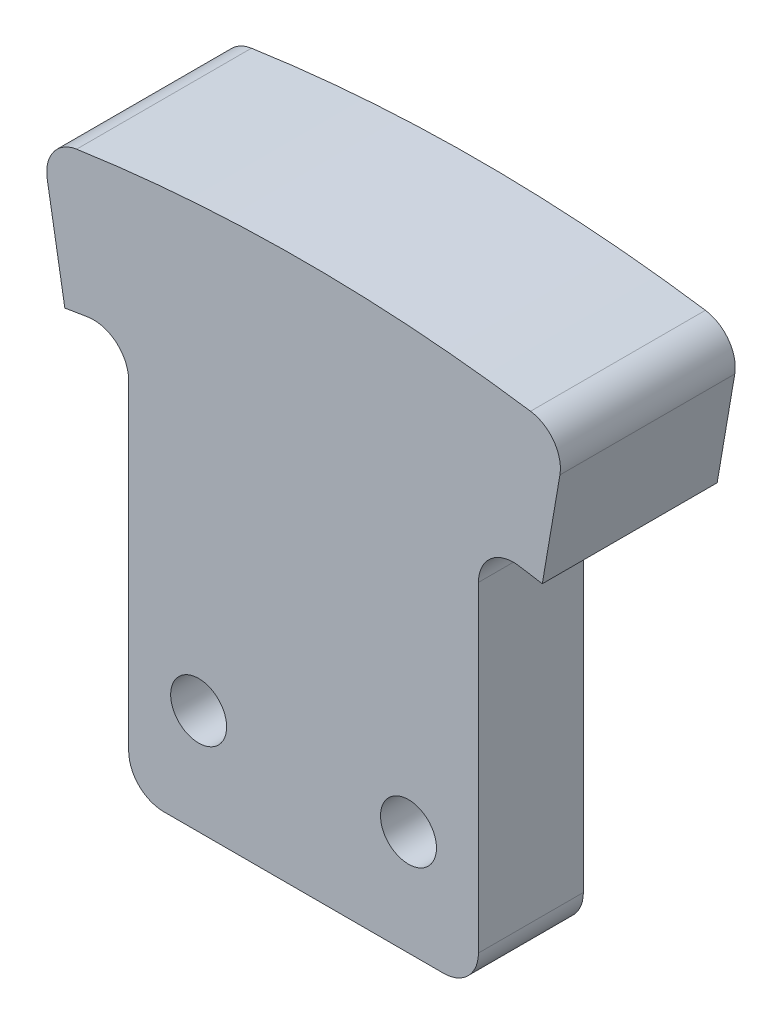
ISO-10303-21;
HEADER;
FILE_DESCRIPTION(('STEP AP214'),'2;1');
FILE_NAME('part.step','',(''),(''),'','','');
FILE_SCHEMA(('AUTOMOTIVE_DESIGN { 1 0 10303 214 1 1 1 1 }'));
ENDSEC;
DATA;
#1=APPLICATION_CONTEXT('core data for automotive mechanical design processes');
#2=APPLICATION_PROTOCOL_DEFINITION('international standard','automotive_design',2000,#1);
#3=PRODUCT_CONTEXT('',#1,'mechanical');
#4=PRODUCT('Part','Part','',(#3));
#5=PRODUCT_RELATED_PRODUCT_CATEGORY('part','',(#4));
#6=PRODUCT_DEFINITION_FORMATION('','',#4);
#7=PRODUCT_DEFINITION_CONTEXT('part definition',#1,'design');
#8=PRODUCT_DEFINITION('design','',#6,#7);
#9=PRODUCT_DEFINITION_SHAPE('','',#8);
#10=(LENGTH_UNIT() NAMED_UNIT(*) SI_UNIT(.MILLI.,.METRE.));
#11=(NAMED_UNIT(*) PLANE_ANGLE_UNIT() SI_UNIT($,.RADIAN.));
#12=(NAMED_UNIT(*) SI_UNIT($,.STERADIAN.) SOLID_ANGLE_UNIT());
#13=UNCERTAINTY_MEASURE_WITH_UNIT(LENGTH_MEASURE(1.E-05),#10,'distance_accuracy_value','');
#14=(GEOMETRIC_REPRESENTATION_CONTEXT(3) GLOBAL_UNCERTAINTY_ASSIGNED_CONTEXT((#13)) GLOBAL_UNIT_ASSIGNED_CONTEXT((#10,
#11,#12)) REPRESENTATION_CONTEXT('',''));
#15=CARTESIAN_POINT('',(0.,0.,0.));
#16=DIRECTION('',(0.,0.,1.));
#17=DIRECTION('',(1.,0.,0.));
#18=AXIS2_PLACEMENT_3D('',#15,#16,#17);
#19=CARTESIAN_POINT('',(0.,0.,0.));
#20=DIRECTION('',(0.,0.,-1.));
#21=DIRECTION('',(-1.,0.,0.));
#22=AXIS2_PLACEMENT_3D('',#19,#20,#21);
#23=PLANE('',#22);
#24=CARTESIAN_POINT('',(-3.,-4.5,0.));
#25=DIRECTION('',(0.,0.,1.));
#26=DIRECTION('',(1.,0.,0.));
#27=AXIS2_PLACEMENT_3D('',#24,#25,#26);
#28=CIRCLE('',#27,0.799999999999999);
#29=CARTESIAN_POINT('',(-2.2,-4.5,0.));
#30=VERTEX_POINT('',#29);
#31=EDGE_CURVE('E223',#30,#30,#28,.T.);
#32=ORIENTED_EDGE('',*,*,#31,.T.);
#33=EDGE_LOOP('',(#32));
#34=FACE_BOUND('',#33,.T.);
#35=CARTESIAN_POINT('',(3.,-4.5,0.));
#36=DIRECTION('',(0.,0.,1.));
#37=DIRECTION('',(1.,0.,0.));
#38=AXIS2_PLACEMENT_3D('',#35,#36,#37);
#39=CIRCLE('',#38,0.799999999999999);
#40=CARTESIAN_POINT('',(3.8,-4.5,0.));
#41=VERTEX_POINT('',#40);
#42=EDGE_CURVE('E215',#41,#41,#39,.T.);
#43=ORIENTED_EDGE('',*,*,#42,.T.);
#44=EDGE_LOOP('',(#43));
#45=FACE_BOUND('',#44,.T.);
#46=DIRECTION('',(1.,0.,0.));
#47=VECTOR('',#46,1.);
#48=CARTESIAN_POINT('',(-5.,-7.5,0.));
#49=LINE('',#48,#47);
#50=CARTESIAN_POINT('',(-4.,-7.5,0.));
#51=VERTEX_POINT('',#50);
#52=CARTESIAN_POINT('',(4.,-7.5,0.));
#53=VERTEX_POINT('',#52);
#54=EDGE_CURVE('E232',#51,#53,#49,.T.);
#55=ORIENTED_EDGE('',*,*,#54,.F.);
#56=CARTESIAN_POINT('',(-4.,-6.5,0.));
#57=DIRECTION('',(0.,0.,-1.));
#58=DIRECTION('',(-1.,0.,0.));
#59=AXIS2_PLACEMENT_3D('',#56,#57,#58);
#60=CIRCLE('',#59,1.);
#61=CARTESIAN_POINT('',(-5.,-6.5,0.));
#62=VERTEX_POINT('',#61);
#63=EDGE_CURVE('E393',#51,#62,#60,.T.);
#64=ORIENTED_EDGE('',*,*,#63,.T.);
#65=DIRECTION('',(0.,-1.,0.));
#66=VECTOR('',#65,1.);
#67=CARTESIAN_POINT('',(-5.,-7.5,0.));
#68=LINE('',#67,#66);
#69=CARTESIAN_POINT('',(-5.,2.67822003365732,0.));
#70=VERTEX_POINT('',#69);
#71=EDGE_CURVE('E240',#70,#62,#68,.T.);
#72=ORIENTED_EDGE('',*,*,#71,.F.);
#73=CARTESIAN_POINT('',(-6.,2.67822003365732,0.));
#74=DIRECTION('',(0.,0.,-1.));
#75=DIRECTION('',(-1.,0.,0.));
#76=AXIS2_PLACEMENT_3D('',#73,#74,#75);
#77=CIRCLE('',#76,1.);
#78=CARTESIAN_POINT('',(-5.0097603585125,2.8175952553727,0.));
#79=VERTEX_POINT('',#78);
#80=EDGE_CURVE('E289',#70,#79,#77,.F.);
#81=ORIENTED_EDGE('',*,*,#80,.T.);
#82=CARTESIAN_POINT('',(0.,-36.3634243989226,0.));
#83=DIRECTION('',(0.,0.,-1.));
#84=DIRECTION('',(-1.,0.,0.));
#85=AXIS2_PLACEMENT_3D('',#82,#83,#84);
#86=CIRCLE('',#85,39.5);
#87=CARTESIAN_POINT('',(5.0097603585125,2.8175952553727,0.));
#88=VERTEX_POINT('',#87);
#89=EDGE_CURVE('E279',#79,#88,#86,.T.);
#90=ORIENTED_EDGE('',*,*,#89,.T.);
#91=CARTESIAN_POINT('',(6.,2.67822003365732,0.));
#92=DIRECTION('',(0.,0.,-1.));
#93=DIRECTION('',(-1.,0.,0.));
#94=AXIS2_PLACEMENT_3D('',#91,#92,#93);
#95=CIRCLE('',#94,1.);
#96=CARTESIAN_POINT('',(5.,2.67822003365732,0.));
#97=VERTEX_POINT('',#96);
#98=EDGE_CURVE('E299',#88,#97,#95,.F.);
#99=ORIENTED_EDGE('',*,*,#98,.T.);
#100=DIRECTION('',(0.,1.,0.));
#101=VECTOR('',#100,1.);
#102=CARTESIAN_POINT('',(5.,-7.5,0.));
#103=LINE('',#102,#101);
#104=CARTESIAN_POINT('',(5.,-6.5,0.));
#105=VERTEX_POINT('',#104);
#106=EDGE_CURVE('E227',#105,#97,#103,.T.);
#107=ORIENTED_EDGE('',*,*,#106,.F.);
#108=CARTESIAN_POINT('',(4.,-6.5,0.));
#109=DIRECTION('',(0.,0.,-1.));
#110=DIRECTION('',(-1.,0.,0.));
#111=AXIS2_PLACEMENT_3D('',#108,#109,#110);
#112=CIRCLE('',#111,1.);
#113=EDGE_CURVE('E397',#105,#53,#112,.T.);
#114=ORIENTED_EDGE('',*,*,#113,.T.);
#115=EDGE_LOOP('',(#55,#64,#72,#81,#90,#99,#107,#114));
#116=FACE_BOUND('',#115,.T.);
#117=ADVANCED_FACE('F46',(#34,#45,#116),#23,.T.);
#118=CARTESIAN_POINT('',(5.,-7.5,3.));
#119=DIRECTION('',(-1.,0.,0.));
#120=DIRECTION('',(0.,0.,1.));
#121=AXIS2_PLACEMENT_3D('',#118,#119,#120);
#122=PLANE('',#121);
#123=DIRECTION('',(0.,1.,0.));
#124=VECTOR('',#123,1.);
#125=CARTESIAN_POINT('',(5.,-7.5,3.));
#126=LINE('',#125,#124);
#127=CARTESIAN_POINT('',(5.,-6.5,3.));
#128=VERTEX_POINT('',#127);
#129=CARTESIAN_POINT('',(5.,2.67822003365732,3.));
#130=VERTEX_POINT('',#129);
#131=EDGE_CURVE('E228',#128,#130,#126,.T.);
#132=ORIENTED_EDGE('',*,*,#131,.F.);
#133=DIRECTION('',(0.,0.,-1.));
#134=VECTOR('',#133,1.);
#135=CARTESIAN_POINT('',(5.,-6.5,3.));
#136=LINE('',#135,#134);
#137=EDGE_CURVE('E11',#128,#105,#136,.T.);
#138=ORIENTED_EDGE('',*,*,#137,.T.);
#139=ORIENTED_EDGE('',*,*,#106,.T.);
#140=DIRECTION('',(0.,0.,1.));
#141=VECTOR('',#140,1.);
#142=CARTESIAN_POINT('',(5.,2.67822003365732,3.));
#143=LINE('',#142,#141);
#144=EDGE_CURVE('E285',#97,#130,#143,.T.);
#145=ORIENTED_EDGE('',*,*,#144,.T.);
#146=EDGE_LOOP('',(#132,#138,#139,#145));
#147=FACE_BOUND('',#146,.T.);
#148=ADVANCED_FACE('F341',(#147),#122,.F.);
#149=CARTESIAN_POINT('',(-5.,-7.5,3.));
#150=DIRECTION('',(1.,0.,0.));
#151=DIRECTION('',(0.,0.,-1.));
#152=AXIS2_PLACEMENT_3D('',#149,#150,#151);
#153=PLANE('',#152);
#154=ORIENTED_EDGE('',*,*,#71,.T.);
#155=DIRECTION('',(0.,0.,-1.));
#156=VECTOR('',#155,1.);
#157=CARTESIAN_POINT('',(-5.,-6.5,3.));
#158=LINE('',#157,#156);
#159=CARTESIAN_POINT('',(-5.,-6.5,3.));
#160=VERTEX_POINT('',#159);
#161=EDGE_CURVE('E70',#62,#160,#158,.F.);
#162=ORIENTED_EDGE('',*,*,#161,.T.);
#163=DIRECTION('',(0.,-1.,0.));
#164=VECTOR('',#163,1.);
#165=CARTESIAN_POINT('',(-5.,-7.5,3.));
#166=LINE('',#165,#164);
#167=CARTESIAN_POINT('',(-5.,2.67822003365732,3.));
#168=VERTEX_POINT('',#167);
#169=EDGE_CURVE('E231',#168,#160,#166,.T.);
#170=ORIENTED_EDGE('',*,*,#169,.F.);
#171=DIRECTION('',(0.,0.,1.));
#172=VECTOR('',#171,1.);
#173=CARTESIAN_POINT('',(-5.,2.67822003365732,3.));
#174=LINE('',#173,#172);
#175=EDGE_CURVE('E282',#168,#70,#174,.F.);
#176=ORIENTED_EDGE('',*,*,#175,.T.);
#177=EDGE_LOOP('',(#154,#162,#170,#176));
#178=FACE_BOUND('',#177,.T.);
#179=ADVANCED_FACE('F346',(#178),#153,.F.);
#180=CARTESIAN_POINT('',(-5.,-7.5,3.));
#181=DIRECTION('',(0.,1.,0.));
#182=DIRECTION('',(0.,0.,1.));
#183=AXIS2_PLACEMENT_3D('',#180,#181,#182);
#184=PLANE('',#183);
#185=DIRECTION('',(1.,0.,0.));
#186=VECTOR('',#185,1.);
#187=CARTESIAN_POINT('',(-5.,-7.5,3.));
#188=LINE('',#187,#186);
#189=CARTESIAN_POINT('',(-4.,-7.5,3.));
#190=VERTEX_POINT('',#189);
#191=CARTESIAN_POINT('',(4.,-7.5,3.));
#192=VERTEX_POINT('',#191);
#193=EDGE_CURVE('E235',#190,#192,#188,.T.);
#194=ORIENTED_EDGE('',*,*,#193,.F.);
#195=DIRECTION('',(0.,0.,-1.));
#196=VECTOR('',#195,1.);
#197=CARTESIAN_POINT('',(-4.,-7.5,3.));
#198=LINE('',#197,#196);
#199=EDGE_CURVE('E403',#190,#51,#198,.T.);
#200=ORIENTED_EDGE('',*,*,#199,.T.);
#201=ORIENTED_EDGE('',*,*,#54,.T.);
#202=DIRECTION('',(0.,0.,-1.));
#203=VECTOR('',#202,1.);
#204=CARTESIAN_POINT('',(4.,-7.5,3.));
#205=LINE('',#204,#203);
#206=EDGE_CURVE('E303',#53,#192,#205,.F.);
#207=ORIENTED_EDGE('',*,*,#206,.T.);
#208=EDGE_LOOP('',(#194,#200,#201,#207));
#209=FACE_BOUND('',#208,.T.);
#210=ADVANCED_FACE('F354',(#209),#184,.F.);
#211=CARTESIAN_POINT('',(0.,0.,3.));
#212=DIRECTION('',(0.,0.,-1.));
#213=DIRECTION('',(-1.,0.,0.));
#214=AXIS2_PLACEMENT_3D('',#211,#212,#213);
#215=PLANE('',#214);
#216=ORIENTED_EDGE('',*,*,#169,.T.);
#217=CARTESIAN_POINT('',(-4.,-6.5,3.));
#218=DIRECTION('',(0.,0.,-1.));
#219=DIRECTION('',(-1.,0.,0.));
#220=AXIS2_PLACEMENT_3D('',#217,#218,#219);
#221=CIRCLE('',#220,1.);
#222=EDGE_CURVE('E55',#160,#190,#221,.F.);
#223=ORIENTED_EDGE('',*,*,#222,.T.);
#224=ORIENTED_EDGE('',*,*,#193,.T.);
#225=CARTESIAN_POINT('',(4.,-6.5,3.));
#226=DIRECTION('',(0.,0.,-1.));
#227=DIRECTION('',(-1.,0.,0.));
#228=AXIS2_PLACEMENT_3D('',#225,#226,#227);
#229=CIRCLE('',#228,1.);
#230=EDGE_CURVE('E62',#192,#128,#229,.F.);
#231=ORIENTED_EDGE('',*,*,#230,.T.);
#232=ORIENTED_EDGE('',*,*,#131,.T.);
#233=CARTESIAN_POINT('',(6.,2.67822003365732,3.));
#234=DIRECTION('',(0.,0.,-1.));
#235=DIRECTION('',(-1.,0.,0.));
#236=AXIS2_PLACEMENT_3D('',#233,#234,#235);
#237=CIRCLE('',#236,1.);
#238=CARTESIAN_POINT('',(6.15189873417722,3.66661609524162,3.));
#239=VERTEX_POINT('',#238);
#240=EDGE_CURVE('E296',#130,#239,#237,.T.);
#241=ORIENTED_EDGE('',*,*,#240,.T.);
#242=CARTESIAN_POINT('',(0.,-36.3634243989226,3.));
#243=DIRECTION('',(0.,0.,-1.));
#244=DIRECTION('',(-1.,0.,0.));
#245=AXIS2_PLACEMENT_3D('',#242,#243,#244);
#246=CIRCLE('',#245,40.5);
#247=CARTESIAN_POINT('',(6.82584269662921,3.55722027874852,3.));
#248=VERTEX_POINT('',#247);
#249=EDGE_CURVE('E203',#239,#248,#246,.T.);
#250=ORIENTED_EDGE('',*,*,#249,.T.);
#251=DIRECTION('',(0.168539325842696,0.985694930312868,0.));
#252=VECTOR('',#251,1.);
#253=CARTESIAN_POINT('',(7.5,7.5,3.));
#254=LINE('',#253,#252);
#255=CARTESIAN_POINT('',(7.32952318451614,6.50297374563393,3.));
#256=VERTEX_POINT('',#255);
#257=EDGE_CURVE('E206',#248,#256,#254,.T.);
#258=ORIENTED_EDGE('',*,*,#257,.T.);
#259=CARTESIAN_POINT('',(6.34382825420327,6.67151307147663,3.));
#260=DIRECTION('',(0.,0.,-1.));
#261=DIRECTION('',(-1.,0.,0.));
#262=AXIS2_PLACEMENT_3D('',#259,#260,#261);
#263=CIRCLE('',#262,1.);
#264=CARTESIAN_POINT('',(6.4896633864838,7.66082197884212,3.));
#265=VERTEX_POINT('',#264);
#266=EDGE_CURVE('E252',#256,#265,#263,.F.);
#267=ORIENTED_EDGE('',*,*,#266,.T.);
#268=CARTESIAN_POINT('',(0.,-36.3634243989226,3.));
#269=DIRECTION('',(0.,0.,1.));
#270=DIRECTION('',(-1.,0.,0.));
#271=AXIS2_PLACEMENT_3D('',#268,#269,#270);
#272=CIRCLE('',#271,44.5);
#273=CARTESIAN_POINT('',(-6.4896633864838,7.66082197884212,3.));
#274=VERTEX_POINT('',#273);
#275=EDGE_CURVE('E195',#265,#274,#272,.T.);
#276=ORIENTED_EDGE('',*,*,#275,.T.);
#277=CARTESIAN_POINT('',(-6.34382825420327,6.67151307147662,3.));
#278=DIRECTION('',(0.,0.,-1.));
#279=DIRECTION('',(-1.,0.,0.));
#280=AXIS2_PLACEMENT_3D('',#277,#278,#279);
#281=CIRCLE('',#280,1.);
#282=CARTESIAN_POINT('',(-7.32952318451613,6.50297374563392,3.));
#283=VERTEX_POINT('',#282);
#284=EDGE_CURVE('E255',#274,#283,#281,.F.);
#285=ORIENTED_EDGE('',*,*,#284,.T.);
#286=DIRECTION('',(0.168539325842697,-0.985694930312868,0.));
#287=VECTOR('',#286,1.);
#288=CARTESIAN_POINT('',(-7.5,7.5,3.));
#289=LINE('',#288,#287);
#290=CARTESIAN_POINT('',(-6.82584269662921,3.55722027874852,3.));
#291=VERTEX_POINT('',#290);
#292=EDGE_CURVE('E199',#283,#291,#289,.T.);
#293=ORIENTED_EDGE('',*,*,#292,.T.);
#294=CARTESIAN_POINT('',(-6.15189873417722,3.66661609524162,3.));
#295=VERTEX_POINT('',#294);
#296=EDGE_CURVE('E179',#291,#295,#246,.T.);
#297=ORIENTED_EDGE('',*,*,#296,.T.);
#298=CARTESIAN_POINT('',(-6.,2.67822003365732,3.));
#299=DIRECTION('',(0.,0.,-1.));
#300=DIRECTION('',(-1.,0.,0.));
#301=AXIS2_PLACEMENT_3D('',#298,#299,#300);
#302=CIRCLE('',#301,1.);
#303=EDGE_CURVE('E293',#295,#168,#302,.T.);
#304=ORIENTED_EDGE('',*,*,#303,.T.);
#305=EDGE_LOOP('',(#216,#223,#224,#231,#232,#241,#250,#258,#267,#276,#285,#293,#297,#304));
#306=FACE_BOUND('',#305,.T.);
#307=CARTESIAN_POINT('',(3.,-4.5,3.));
#308=DIRECTION('',(0.,0.,1.));
#309=DIRECTION('',(1.,0.,0.));
#310=AXIS2_PLACEMENT_3D('',#307,#308,#309);
#311=CIRCLE('',#310,0.8);
#312=CARTESIAN_POINT('',(3.8,-4.5,3.));
#313=VERTEX_POINT('',#312);
#314=EDGE_CURVE('E210',#313,#313,#311,.T.);
#315=ORIENTED_EDGE('',*,*,#314,.F.);
#316=EDGE_LOOP('',(#315));
#317=FACE_BOUND('',#316,.T.);
#318=CARTESIAN_POINT('',(-3.,-4.5,3.));
#319=DIRECTION('',(0.,0.,1.));
#320=DIRECTION('',(1.,0.,0.));
#321=AXIS2_PLACEMENT_3D('',#318,#319,#320);
#322=CIRCLE('',#321,0.8);
#323=CARTESIAN_POINT('',(-2.2,-4.5,3.));
#324=VERTEX_POINT('',#323);
#325=EDGE_CURVE('E219',#324,#324,#322,.T.);
#326=ORIENTED_EDGE('',*,*,#325,.F.);
#327=EDGE_LOOP('',(#326));
#328=FACE_BOUND('',#327,.T.);
#329=ADVANCED_FACE('F352',(#306,#317,#328),#215,.F.);
#330=CARTESIAN_POINT('',(-3.,-4.5,3.));
#331=DIRECTION('',(0.,0.,1.));
#332=DIRECTION('',(1.,0.,0.));
#333=AXIS2_PLACEMENT_3D('',#330,#331,#332);
#334=CYLINDRICAL_SURFACE('',#333,0.799999999999999);
#335=ORIENTED_EDGE('',*,*,#31,.F.);
#336=EDGE_LOOP('',(#335));
#337=FACE_BOUND('',#336,.T.);
#338=ORIENTED_EDGE('',*,*,#325,.T.);
#339=EDGE_LOOP('',(#338));
#340=FACE_BOUND('',#339,.T.);
#341=ADVANCED_FACE('F525',(#337,#340),#334,.F.);
#342=CARTESIAN_POINT('',(3.,-4.5,3.));
#343=DIRECTION('',(0.,0.,1.));
#344=DIRECTION('',(1.,0.,0.));
#345=AXIS2_PLACEMENT_3D('',#342,#343,#344);
#346=CYLINDRICAL_SURFACE('',#345,0.799999999999999);
#347=ORIENTED_EDGE('',*,*,#42,.F.);
#348=EDGE_LOOP('',(#347));
#349=FACE_BOUND('',#348,.T.);
#350=ORIENTED_EDGE('',*,*,#314,.T.);
#351=EDGE_LOOP('',(#350));
#352=FACE_BOUND('',#351,.T.);
#353=ADVANCED_FACE('F520',(#349,#352),#346,.F.);
#354=CARTESIAN_POINT('',(0.,-36.3634243989226,-2.));
#355=DIRECTION('',(0.,0.,1.));
#356=DIRECTION('',(1.,0.,0.));
#357=AXIS2_PLACEMENT_3D('',#354,#355,#356);
#358=CYLINDRICAL_SURFACE('',#357,40.5);
#359=CARTESIAN_POINT('',(0.,-36.3634243989226,-1.));
#360=DIRECTION('',(0.,0.,-1.));
#361=DIRECTION('',(-1.,0.,0.));
#362=AXIS2_PLACEMENT_3D('',#359,#360,#361);
#363=CIRCLE('',#362,40.5);
#364=CARTESIAN_POINT('',(6.15189873417722,3.66661609524162,-1.));
#365=VERTEX_POINT('',#364);
#366=CARTESIAN_POINT('',(-6.15189873417722,3.66661609524162,-1.));
#367=VERTEX_POINT('',#366);
#368=EDGE_CURVE('E273',#365,#367,#363,.F.);
#369=ORIENTED_EDGE('',*,*,#368,.T.);
#370=DIRECTION('',(0.,0.,1.));
#371=VECTOR('',#370,1.);
#372=CARTESIAN_POINT('',(-6.15189873417722,3.66661609524162,-2.));
#373=LINE('',#372,#371);
#374=EDGE_CURVE('E276',#367,#295,#373,.T.);
#375=ORIENTED_EDGE('',*,*,#374,.T.);
#376=ORIENTED_EDGE('',*,*,#296,.F.);
#377=DIRECTION('',(0.,0.,1.));
#378=VECTOR('',#377,1.);
#379=CARTESIAN_POINT('',(-6.82584269662921,3.55722027874852,-2.));
#380=LINE('',#379,#378);
#381=CARTESIAN_POINT('',(-6.82584269662921,3.55722027874852,-2.));
#382=VERTEX_POINT('',#381);
#383=EDGE_CURVE('E161',#382,#291,#380,.T.);
#384=ORIENTED_EDGE('',*,*,#383,.F.);
#385=CARTESIAN_POINT('',(0.,-36.3634243989226,-2.));
#386=DIRECTION('',(0.,0.,-1.));
#387=DIRECTION('',(-1.,0.,0.));
#388=AXIS2_PLACEMENT_3D('',#385,#386,#387);
#389=CIRCLE('',#388,40.5);
#390=CARTESIAN_POINT('',(6.82584269662921,3.55722027874852,-2.));
#391=VERTEX_POINT('',#390);
#392=EDGE_CURVE('E169',#382,#391,#389,.T.);
#393=ORIENTED_EDGE('',*,*,#392,.T.);
#394=DIRECTION('',(0.,0.,1.));
#395=VECTOR('',#394,1.);
#396=CARTESIAN_POINT('',(6.82584269662921,3.55722027874852,-2.));
#397=LINE('',#396,#395);
#398=EDGE_CURVE('E181',#391,#248,#397,.T.);
#399=ORIENTED_EDGE('',*,*,#398,.T.);
#400=ORIENTED_EDGE('',*,*,#249,.F.);
#401=DIRECTION('',(0.,0.,1.));
#402=VECTOR('',#401,1.);
#403=CARTESIAN_POINT('',(6.15189873417722,3.66661609524162,-2.));
#404=LINE('',#403,#402);
#405=EDGE_CURVE('E270',#239,#365,#404,.F.);
#406=ORIENTED_EDGE('',*,*,#405,.T.);
#407=EDGE_LOOP('',(#369,#375,#376,#384,#393,#399,#400,#406));
#408=FACE_BOUND('',#407,.T.);
#409=ADVANCED_FACE('F175',(#408),#358,.F.);
#410=CARTESIAN_POINT('',(0.,-36.3634243989226,-2.));
#411=DIRECTION('',(0.,0.,1.));
#412=DIRECTION('',(1.,0.,0.));
#413=AXIS2_PLACEMENT_3D('',#410,#411,#412);
#414=CYLINDRICAL_SURFACE('',#413,44.5);
#415=CARTESIAN_POINT('',(0.,-36.3634243989226,-2.));
#416=DIRECTION('',(0.,0.,1.));
#417=DIRECTION('',(-1.,0.,0.));
#418=AXIS2_PLACEMENT_3D('',#415,#416,#417);
#419=CIRCLE('',#418,44.5);
#420=CARTESIAN_POINT('',(6.4896633864838,7.66082197884212,-2.));
#421=VERTEX_POINT('',#420);
#422=CARTESIAN_POINT('',(-6.4896633864838,7.66082197884212,-2.));
#423=VERTEX_POINT('',#422);
#424=EDGE_CURVE('E170',#421,#423,#419,.T.);
#425=ORIENTED_EDGE('',*,*,#424,.T.);
#426=DIRECTION('',(0.,0.,1.));
#427=VECTOR('',#426,1.);
#428=CARTESIAN_POINT('',(-6.4896633864838,7.66082197884212,-2.));
#429=LINE('',#428,#427);
#430=EDGE_CURVE('E248',#423,#274,#429,.T.);
#431=ORIENTED_EDGE('',*,*,#430,.T.);
#432=ORIENTED_EDGE('',*,*,#275,.F.);
#433=DIRECTION('',(0.,0.,1.));
#434=VECTOR('',#433,1.);
#435=CARTESIAN_POINT('',(6.4896633864838,7.66082197884212,-2.));
#436=LINE('',#435,#434);
#437=EDGE_CURVE('E237',#265,#421,#436,.F.);
#438=ORIENTED_EDGE('',*,*,#437,.T.);
#439=EDGE_LOOP('',(#425,#431,#432,#438));
#440=FACE_BOUND('',#439,.T.);
#441=ADVANCED_FACE('F512',(#440),#414,.T.);
#442=CARTESIAN_POINT('',(7.5,7.5,-2.));
#443=DIRECTION('',(0.985694930312868,-0.168539325842696,0.));
#444=DIRECTION('',(0.168539325842696,0.985694930312868,0.));
#445=AXIS2_PLACEMENT_3D('',#442,#443,#444);
#446=PLANE('',#445);
#447=DIRECTION('',(0.168539325842696,0.985694930312868,0.));
#448=VECTOR('',#447,1.);
#449=CARTESIAN_POINT('',(7.5,7.5,-2.));
#450=LINE('',#449,#448);
#451=CARTESIAN_POINT('',(7.32952318451614,6.50297374563393,-2.));
#452=VERTEX_POINT('',#451);
#453=EDGE_CURVE('E182',#391,#452,#450,.T.);
#454=ORIENTED_EDGE('',*,*,#453,.T.);
#455=DIRECTION('',(0.,0.,1.));
#456=VECTOR('',#455,1.);
#457=CARTESIAN_POINT('',(7.32952318451614,6.50297374563393,-2.));
#458=LINE('',#457,#456);
#459=EDGE_CURVE('E266',#452,#256,#458,.T.);
#460=ORIENTED_EDGE('',*,*,#459,.T.);
#461=ORIENTED_EDGE('',*,*,#257,.F.);
#462=ORIENTED_EDGE('',*,*,#398,.F.);
#463=EDGE_LOOP('',(#454,#460,#461,#462));
#464=FACE_BOUND('',#463,.T.);
#465=ADVANCED_FACE('F372',(#464),#446,.T.);
#466=CARTESIAN_POINT('',(-7.5,7.5,-2.));
#467=DIRECTION('',(-0.985694930312868,-0.168539325842697,0.));
#468=DIRECTION('',(0.168539325842697,-0.985694930312868,0.));
#469=AXIS2_PLACEMENT_3D('',#466,#467,#468);
#470=PLANE('',#469);
#471=ORIENTED_EDGE('',*,*,#292,.F.);
#472=DIRECTION('',(0.,0.,1.));
#473=VECTOR('',#472,1.);
#474=CARTESIAN_POINT('',(-7.32952318451613,6.50297374563392,-2.));
#475=LINE('',#474,#473);
#476=CARTESIAN_POINT('',(-7.32952318451613,6.50297374563392,-2.));
#477=VERTEX_POINT('',#476);
#478=EDGE_CURVE('E164',#283,#477,#475,.F.);
#479=ORIENTED_EDGE('',*,*,#478,.T.);
#480=DIRECTION('',(0.168539325842697,-0.985694930312868,0.));
#481=VECTOR('',#480,1.);
#482=CARTESIAN_POINT('',(-7.5,7.5,-2.));
#483=LINE('',#482,#481);
#484=EDGE_CURVE('E157',#477,#382,#483,.T.);
#485=ORIENTED_EDGE('',*,*,#484,.T.);
#486=ORIENTED_EDGE('',*,*,#383,.T.);
#487=EDGE_LOOP('',(#471,#479,#485,#486));
#488=FACE_BOUND('',#487,.T.);
#489=ADVANCED_FACE('F160',(#488),#470,.T.);
#490=CARTESIAN_POINT('',(0.,-36.3634243989226,-2.));
#491=DIRECTION('',(0.,0.,-1.));
#492=DIRECTION('',(-1.,0.,0.));
#493=AXIS2_PLACEMENT_3D('',#490,#491,#492);
#494=PLANE('',#493);
#495=ORIENTED_EDGE('',*,*,#484,.F.);
#496=CARTESIAN_POINT('',(-6.34382825420327,6.67151307147662,-2.));
#497=DIRECTION('',(0.,0.,-1.));
#498=DIRECTION('',(-1.,0.,0.));
#499=AXIS2_PLACEMENT_3D('',#496,#497,#498);
#500=CIRCLE('',#499,1.);
#501=EDGE_CURVE('E263',#477,#423,#500,.T.);
#502=ORIENTED_EDGE('',*,*,#501,.T.);
#503=ORIENTED_EDGE('',*,*,#424,.F.);
#504=CARTESIAN_POINT('',(6.34382825420327,6.67151307147663,-2.));
#505=DIRECTION('',(0.,0.,-1.));
#506=DIRECTION('',(-1.,0.,0.));
#507=AXIS2_PLACEMENT_3D('',#504,#505,#506);
#508=CIRCLE('',#507,1.);
#509=EDGE_CURVE('E260',#421,#452,#508,.T.);
#510=ORIENTED_EDGE('',*,*,#509,.T.);
#511=ORIENTED_EDGE('',*,*,#453,.F.);
#512=ORIENTED_EDGE('',*,*,#392,.F.);
#513=EDGE_LOOP('',(#495,#502,#503,#510,#511,#512));
#514=FACE_BOUND('',#513,.T.);
#515=ADVANCED_FACE('F184',(#514),#494,.T.);
#516=CARTESIAN_POINT('',(-6.34382825420327,6.67151307147662,-2.));
#517=DIRECTION('',(0.,0.,1.));
#518=DIRECTION('',(1.,0.,0.));
#519=AXIS2_PLACEMENT_3D('',#516,#517,#518);
#520=CYLINDRICAL_SURFACE('',#519,1.);
#521=ORIENTED_EDGE('',*,*,#501,.F.);
#522=ORIENTED_EDGE('',*,*,#478,.F.);
#523=ORIENTED_EDGE('',*,*,#284,.F.);
#524=ORIENTED_EDGE('',*,*,#430,.F.);
#525=EDGE_LOOP('',(#521,#522,#523,#524));
#526=FACE_BOUND('',#525,.T.);
#527=ADVANCED_FACE('F360',(#526),#520,.T.);
#528=CARTESIAN_POINT('',(6.34382825420327,6.67151307147663,-2.));
#529=DIRECTION('',(0.,0.,1.));
#530=DIRECTION('',(1.,0.,0.));
#531=AXIS2_PLACEMENT_3D('',#528,#529,#530);
#532=CYLINDRICAL_SURFACE('',#531,1.);
#533=ORIENTED_EDGE('',*,*,#509,.F.);
#534=ORIENTED_EDGE('',*,*,#437,.F.);
#535=ORIENTED_EDGE('',*,*,#266,.F.);
#536=ORIENTED_EDGE('',*,*,#459,.F.);
#537=EDGE_LOOP('',(#533,#534,#535,#536));
#538=FACE_BOUND('',#537,.T.);
#539=ADVANCED_FACE('F329',(#538),#532,.T.);
#540=CARTESIAN_POINT('',(6.,2.67822003365732,-2.));
#541=DIRECTION('',(0.,0.,1.));
#542=DIRECTION('',(1.,0.,0.));
#543=AXIS2_PLACEMENT_3D('',#540,#541,#542);
#544=CYLINDRICAL_SURFACE('',#543,1.);
#545=ORIENTED_EDGE('',*,*,#144,.F.);
#546=ORIENTED_EDGE('',*,*,#98,.F.);
#547=CARTESIAN_POINT('',(5.0097603585125,2.8175952553727,0.));
#548=CARTESIAN_POINT('',(5.01289281976915,2.83987282404901,3.03904077864828E-06));
#549=CARTESIAN_POINT('',(5.01678175074646,2.86202962464984,-0.000759681179131453));
#550=CARTESIAN_POINT('',(5.02601056307258,2.90591752022311,-0.00377719974279132));
#551=CARTESIAN_POINT('',(5.03134927223495,2.92764894397236,-0.00603079477723785));
#552=CARTESIAN_POINT('',(5.0493429796438,2.99157904321385,-0.0149145696798512));
#553=CARTESIAN_POINT('',(5.06403698967792,3.03293909230381,-0.0236694000917139));
#554=CARTESIAN_POINT('',(5.09798758184484,3.11207329358057,-0.0461447771591401));
#555=CARTESIAN_POINT('',(5.1172310649008,3.14985731260475,-0.0598511258944051));
#556=CARTESIAN_POINT('',(5.15941509410571,3.22149731255859,-0.091408789918844));
#557=CARTESIAN_POINT('',(5.18236403641749,3.25534406512968,-0.109269560147067));
#558=CARTESIAN_POINT('',(5.2410134697515,3.33175739955249,-0.156262659924848));
#559=CARTESIAN_POINT('',(5.27809961580544,3.37225752612748,-0.187022375605974));
#560=CARTESIAN_POINT('',(5.35594708487742,3.44506296801685,-0.253203044113176));
#561=CARTESIAN_POINT('',(5.39671511539713,3.47735290092525,-0.288632560392863));
#562=CARTESIAN_POINT('',(5.49629476025108,3.54490063062909,-0.376666371585754));
#563=CARTESIAN_POINT('',(5.55613839884482,3.57672837465946,-0.430727946378708));
#564=CARTESIAN_POINT('',(5.6778238123042,3.62719271357185,-0.542565039080639));
#565=CARTESIAN_POINT('',(5.73966795176275,3.64581305366409,-0.60034503836379));
#566=CARTESIAN_POINT('',(5.85966008926676,3.67008604977913,-0.714091068168914));
#567=CARTESIAN_POINT('',(5.91778256495556,3.6765136382517,-0.7699250338624));
#568=CARTESIAN_POINT('',(6.03333187221902,3.67932889699954,-0.882356910777185));
#569=CARTESIAN_POINT('',(6.09075991224066,3.67573770965965,-0.938952962815286));
#570=CARTESIAN_POINT('',(6.14889575774111,3.66707409402954,-0.997000037338645));
#571=CARTESIAN_POINT('',(6.15039753026105,3.66684679919598,-0.998500040474268));
#572=CARTESIAN_POINT('',(6.15189873417722,3.66661609524162,-1.));
#573=B_SPLINE_CURVE_WITH_KNOTS('',3,(#547,#548,#549,#550,#551,#552,#553,#554,#555,#556,#557,
#558,#559,#560,#561,#562,#563,#564,#565,#566,#567,#568,#569,#570,#571,#572),.UNSPECIFIED.,.F.,
.F.,(4,2,2,2,2,2,2,2,2,2,2,2,4),(0.,0.0674376707370484,0.134820977731661,0.268318023209151,
0.401435280351567,0.534858512253352,0.722646907974881,0.910784588825233,1.16949363980225,
1.42852054269413,1.67044734438922,1.91186400010265,1.9182681211197),.UNSPECIFIED.);
#574=EDGE_CURVE('E200',#365,#88,#573,.F.);
#575=ORIENTED_EDGE('',*,*,#574,.F.);
#576=ORIENTED_EDGE('',*,*,#405,.F.);
#577=ORIENTED_EDGE('',*,*,#240,.F.);
#578=EDGE_LOOP('',(#545,#546,#575,#576,#577));
#579=FACE_BOUND('',#578,.T.);
#580=ADVANCED_FACE('F325',(#579),#544,.F.);
#581=CARTESIAN_POINT('',(-6.,2.67822003365732,-2.));
#582=DIRECTION('',(0.,0.,1.));
#583=DIRECTION('',(1.,0.,0.));
#584=AXIS2_PLACEMENT_3D('',#581,#582,#583);
#585=CYLINDRICAL_SURFACE('',#584,1.);
#586=ORIENTED_EDGE('',*,*,#303,.F.);
#587=ORIENTED_EDGE('',*,*,#374,.F.);
#588=CARTESIAN_POINT('',(-5.0097603585125,2.8175952553727,0.));
#589=CARTESIAN_POINT('',(-5.01289281976915,2.839872824049,3.03904077855152E-06));
#590=CARTESIAN_POINT('',(-5.01678175074646,2.86202962464983,-0.000759681179131523));
#591=CARTESIAN_POINT('',(-5.02601056307258,2.90591752022311,-0.00377719974279113));
#592=CARTESIAN_POINT('',(-5.03134927223495,2.92764894397236,-0.00603079477723741));
#593=CARTESIAN_POINT('',(-5.0493429796438,2.99157904321384,-0.0149145696798498));
#594=CARTESIAN_POINT('',(-5.06403698967792,3.0329390923038,-0.0236694000917116));
#595=CARTESIAN_POINT('',(-5.09798758184483,3.11207329358056,-0.0461447771591387));
#596=CARTESIAN_POINT('',(-5.11723106490079,3.14985731260474,-0.0598511258944054));
#597=CARTESIAN_POINT('',(-5.15941509410571,3.22149731255858,-0.0914087899188436));
#598=CARTESIAN_POINT('',(-5.18236403641749,3.25534406512968,-0.109269560147064));
#599=CARTESIAN_POINT('',(-5.24101346975149,3.33175739955248,-0.156262659924841));
#600=CARTESIAN_POINT('',(-5.27809961580543,3.37225752612747,-0.187022375605968));
#601=CARTESIAN_POINT('',(-5.35594708487741,3.44506296801684,-0.25320304411317));
#602=CARTESIAN_POINT('',(-5.39671511539712,3.47735290092524,-0.288632560392856));
#603=CARTESIAN_POINT('',(-5.49629476025107,3.54490063062908,-0.376666371585749));
#604=CARTESIAN_POINT('',(-5.5561383988448,3.57672837465946,-0.430727946378708));
#605=CARTESIAN_POINT('',(-5.6778238123042,3.62719271357185,-0.54256503908062));
#606=CARTESIAN_POINT('',(-5.73966795176277,3.64581305366408,-0.600345038363748));
#607=CARTESIAN_POINT('',(-5.85966008926671,3.67008604977913,-0.714091068168949));
#608=CARTESIAN_POINT('',(-5.91778256495543,3.67651363825172,-0.769925033862526));
#609=CARTESIAN_POINT('',(-6.03333187221914,3.67932889699952,-0.882356910777054));
#610=CARTESIAN_POINT('',(-6.09075991224112,3.67573770965958,-0.938952962814808));
#611=CARTESIAN_POINT('',(-6.14889575774113,3.66707409402954,-0.99700003733862));
#612=CARTESIAN_POINT('',(-6.15039753026106,3.66684679919597,-0.998500040474255));
#613=CARTESIAN_POINT('',(-6.15189873417722,3.66661609524162,-1.));
#614=B_SPLINE_CURVE_WITH_KNOTS('',3,(#588,#589,#590,#591,#592,#593,#594,#595,#596,#597,#598,
#599,#600,#601,#602,#603,#604,#605,#606,#607,#608,#609,#610,#611,#612,#613),.UNSPECIFIED.,.F.,
.F.,(4,2,2,2,2,2,2,2,2,2,2,2,4),(0.,0.0674376707370474,0.134820977731658,0.268318023209147,
0.401435280351561,0.534858512253344,0.722646907974871,0.910784588825222,1.16949363980224,
1.42852054269412,1.67044734438922,1.91186400010265,1.9182681211197),.UNSPECIFIED.);
#615=EDGE_CURVE('E304',#79,#367,#614,.T.);
#616=ORIENTED_EDGE('',*,*,#615,.F.);
#617=ORIENTED_EDGE('',*,*,#80,.F.);
#618=ORIENTED_EDGE('',*,*,#175,.F.);
#619=EDGE_LOOP('',(#586,#587,#616,#617,#618));
#620=FACE_BOUND('',#619,.T.);
#621=ADVANCED_FACE('F322',(#620),#585,.F.);
#622=CARTESIAN_POINT('',(0.,-36.3634243989226,-1.));
#623=DIRECTION('',(0.,0.,-1.));
#624=DIRECTION('',(-1.,0.,0.));
#625=AXIS2_PLACEMENT_3D('',#622,#623,#624);
#626=TOROIDAL_SURFACE('',#625,39.5,1.);
#627=ORIENTED_EDGE('',*,*,#574,.T.);
#628=ORIENTED_EDGE('',*,*,#89,.F.);
#629=ORIENTED_EDGE('',*,*,#615,.T.);
#630=ORIENTED_EDGE('',*,*,#368,.F.);
#631=EDGE_LOOP('',(#627,#628,#629,#630));
#632=FACE_BOUND('',#631,.T.);
#633=ADVANCED_FACE('F319',(#632),#626,.F.);
#634=CARTESIAN_POINT('',(-4.,-6.5,3.));
#635=DIRECTION('',(0.,0.,-1.));
#636=DIRECTION('',(-1.,0.,0.));
#637=AXIS2_PLACEMENT_3D('',#634,#635,#636);
#638=CYLINDRICAL_SURFACE('',#637,1.);
#639=ORIENTED_EDGE('',*,*,#222,.F.);
#640=ORIENTED_EDGE('',*,*,#161,.F.);
#641=ORIENTED_EDGE('',*,*,#63,.F.);
#642=ORIENTED_EDGE('',*,*,#199,.F.);
#643=EDGE_LOOP('',(#639,#640,#641,#642));
#644=FACE_BOUND('',#643,.T.);
#645=ADVANCED_FACE('F331',(#644),#638,.T.);
#646=CARTESIAN_POINT('',(4.,-6.5,3.));
#647=DIRECTION('',(0.,0.,-1.));
#648=DIRECTION('',(-1.,0.,0.));
#649=AXIS2_PLACEMENT_3D('',#646,#647,#648);
#650=CYLINDRICAL_SURFACE('',#649,1.);
#651=ORIENTED_EDGE('',*,*,#230,.F.);
#652=ORIENTED_EDGE('',*,*,#206,.F.);
#653=ORIENTED_EDGE('',*,*,#113,.F.);
#654=ORIENTED_EDGE('',*,*,#137,.F.);
#655=EDGE_LOOP('',(#651,#652,#653,#654));
#656=FACE_BOUND('',#655,.T.);
#657=ADVANCED_FACE('F48',(#656),#650,.T.);
#658=CLOSED_SHELL('',(#117,#148,#179,#210,#329,#341,#353,#409,#441,#465,#489,#515,#527,#539,
#580,#621,#633,#645,#657));
#659=MANIFOLD_SOLID_BREP('B2',#658);
#660=ADVANCED_BREP_SHAPE_REPRESENTATION('',(#18,#659),#14);
#661=SHAPE_DEFINITION_REPRESENTATION(#9,#660);
ENDSEC;
END-ISO-10303-21;
